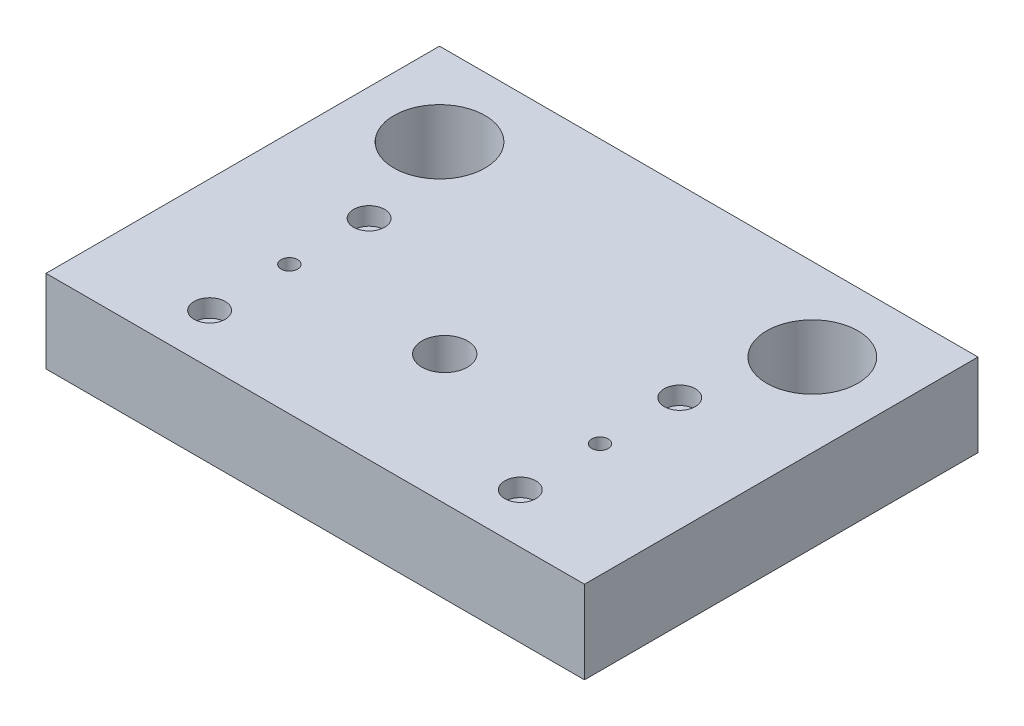
ISO-10303-21;
HEADER;
FILE_DESCRIPTION(('STEP AP214'),'2;1');
FILE_NAME('part.step','',(''),(''),'','','');
FILE_SCHEMA(('AUTOMOTIVE_DESIGN { 1 0 10303 214 1 1 1 1 }'));
ENDSEC;
DATA;
#1=APPLICATION_CONTEXT('core data for automotive mechanical design processes');
#2=APPLICATION_PROTOCOL_DEFINITION('international standard','automotive_design',2000,#1);
#3=PRODUCT_CONTEXT('',#1,'mechanical');
#4=PRODUCT('Part','Part','',(#3));
#5=PRODUCT_RELATED_PRODUCT_CATEGORY('part','',(#4));
#6=PRODUCT_DEFINITION_FORMATION('','',#4);
#7=PRODUCT_DEFINITION_CONTEXT('part definition',#1,'design');
#8=PRODUCT_DEFINITION('design','',#6,#7);
#9=PRODUCT_DEFINITION_SHAPE('','',#8);
#10=(LENGTH_UNIT() NAMED_UNIT(*) SI_UNIT(.MILLI.,.METRE.));
#11=(NAMED_UNIT(*) PLANE_ANGLE_UNIT() SI_UNIT($,.RADIAN.));
#12=(NAMED_UNIT(*) SI_UNIT($,.STERADIAN.) SOLID_ANGLE_UNIT());
#13=UNCERTAINTY_MEASURE_WITH_UNIT(LENGTH_MEASURE(1.E-05),#10,'distance_accuracy_value','');
#14=(GEOMETRIC_REPRESENTATION_CONTEXT(3) GLOBAL_UNCERTAINTY_ASSIGNED_CONTEXT((#13)) GLOBAL_UNIT_ASSIGNED_CONTEXT((#10,
#11,#12)) REPRESENTATION_CONTEXT('',''));
#15=CARTESIAN_POINT('',(0.,0.,0.));
#16=DIRECTION('',(0.,0.,1.));
#17=DIRECTION('',(1.,0.,0.));
#18=AXIS2_PLACEMENT_3D('',#15,#16,#17);
#19=CARTESIAN_POINT('',(0.,-40.,0.));
#20=DIRECTION('',(0.,-1.,0.));
#21=DIRECTION('',(0.,0.,-1.));
#22=AXIS2_PLACEMENT_3D('',#19,#20,#21);
#23=PLANE('',#22);
#24=CARTESIAN_POINT('',(-75.,-40.,32.5));
#25=DIRECTION('',(0.,1.,0.));
#26=DIRECTION('',(0.,0.,1.));
#27=AXIS2_PLACEMENT_3D('',#24,#25,#26);
#28=CIRCLE('',#27,3.99999999999999);
#29=CARTESIAN_POINT('',(-75.,-40.,36.5));
#30=VERTEX_POINT('',#29);
#31=EDGE_CURVE('E598',#30,#30,#28,.T.);
#32=ORIENTED_EDGE('',*,*,#31,.T.);
#33=EDGE_LOOP('',(#32));
#34=FACE_BOUND('',#33,.T.);
#35=DIRECTION('',(0.,0.,-1.));
#36=VECTOR('',#35,1.);
#37=CARTESIAN_POINT('',(130.,-40.,95.));
#38=LINE('',#37,#36);
#39=CARTESIAN_POINT('',(130.,-40.,95.));
#40=VERTEX_POINT('',#39);
#41=CARTESIAN_POINT('',(130.,-40.,-95.));
#42=VERTEX_POINT('',#41);
#43=EDGE_CURVE('E190',#40,#42,#38,.T.);
#44=ORIENTED_EDGE('',*,*,#43,.F.);
#45=DIRECTION('',(1.,0.,0.));
#46=VECTOR('',#45,1.);
#47=CARTESIAN_POINT('',(-130.,-40.,95.));
#48=LINE('',#47,#46);
#49=CARTESIAN_POINT('',(-130.,-40.,95.));
#50=VERTEX_POINT('',#49);
#51=EDGE_CURVE('E200',#50,#40,#48,.T.);
#52=ORIENTED_EDGE('',*,*,#51,.F.);
#53=DIRECTION('',(0.,0.,1.));
#54=VECTOR('',#53,1.);
#55=CARTESIAN_POINT('',(-130.,-40.,95.));
#56=LINE('',#55,#54);
#57=CARTESIAN_POINT('',(-130.,-40.,-95.));
#58=VERTEX_POINT('',#57);
#59=EDGE_CURVE('E197',#58,#50,#56,.T.);
#60=ORIENTED_EDGE('',*,*,#59,.F.);
#61=DIRECTION('',(-1.,0.,0.));
#62=VECTOR('',#61,1.);
#63=CARTESIAN_POINT('',(-130.,-40.,-95.));
#64=LINE('',#63,#62);
#65=EDGE_CURVE('E193',#42,#58,#64,.T.);
#66=ORIENTED_EDGE('',*,*,#65,.F.);
#67=EDGE_LOOP('',(#44,#52,#60,#66));
#68=FACE_BOUND('',#67,.T.);
#69=CARTESIAN_POINT('',(90.,-40.,-55.));
#70=DIRECTION('',(0.,1.,0.));
#71=DIRECTION('',(0.,0.,1.));
#72=AXIS2_PLACEMENT_3D('',#69,#70,#71);
#73=CIRCLE('',#72,22.);
#74=CARTESIAN_POINT('',(90.,-40.,-33.));
#75=VERTEX_POINT('',#74);
#76=EDGE_CURVE('E176',#75,#75,#73,.T.);
#77=ORIENTED_EDGE('',*,*,#76,.T.);
#78=EDGE_LOOP('',(#77));
#79=FACE_BOUND('',#78,.T.);
#80=CARTESIAN_POINT('',(-90.,-40.,-55.));
#81=DIRECTION('',(0.,1.,0.));
#82=DIRECTION('',(0.,0.,1.));
#83=AXIS2_PLACEMENT_3D('',#80,#81,#82);
#84=CIRCLE('',#83,22.);
#85=CARTESIAN_POINT('',(-90.,-40.,-33.));
#86=VERTEX_POINT('',#85);
#87=EDGE_CURVE('E178',#86,#86,#84,.T.);
#88=ORIENTED_EDGE('',*,*,#87,.T.);
#89=EDGE_LOOP('',(#88));
#90=FACE_BOUND('',#89,.T.);
#91=CARTESIAN_POINT('',(35.05,-40.,60.05));
#92=DIRECTION('',(0.,-1.,0.));
#93=DIRECTION('',(0.,0.,-1.));
#94=AXIS2_PLACEMENT_3D('',#91,#92,#93);
#95=CIRCLE('',#94,5.);
#96=CARTESIAN_POINT('',(35.05,-40.,55.05));
#97=VERTEX_POINT('',#96);
#98=CARTESIAN_POINT('',(30.05,-40.,60.05));
#99=VERTEX_POINT('',#98);
#100=EDGE_CURVE('E148',#97,#99,#95,.T.);
#101=ORIENTED_EDGE('',*,*,#100,.F.);
#102=DIRECTION('',(0.,0.,-1.));
#103=VECTOR('',#102,1.);
#104=CARTESIAN_POINT('',(35.05,-40.,60.05));
#105=LINE('',#104,#103);
#106=CARTESIAN_POINT('',(35.05,-40.,9.94999999999999));
#107=VERTEX_POINT('',#106);
#108=EDGE_CURVE('E169',#97,#107,#105,.T.);
#109=ORIENTED_EDGE('',*,*,#108,.T.);
#110=CARTESIAN_POINT('',(35.05,-40.,4.94999999999999));
#111=DIRECTION('',(0.,-1.,0.));
#112=DIRECTION('',(0.,0.,-1.));
#113=AXIS2_PLACEMENT_3D('',#110,#111,#112);
#114=CIRCLE('',#113,5.);
#115=CARTESIAN_POINT('',(30.05,-40.,4.94999999999999));
#116=VERTEX_POINT('',#115);
#117=EDGE_CURVE('E256',#116,#107,#114,.T.);
#118=ORIENTED_EDGE('',*,*,#117,.F.);
#119=DIRECTION('',(-1.,0.,0.));
#120=VECTOR('',#119,1.);
#121=CARTESIAN_POINT('',(35.05,-40.,4.94999999999999));
#122=LINE('',#121,#120);
#123=CARTESIAN_POINT('',(-30.05,-40.,4.94999999999999));
#124=VERTEX_POINT('',#123);
#125=EDGE_CURVE('E165',#116,#124,#122,.T.);
#126=ORIENTED_EDGE('',*,*,#125,.T.);
#127=CARTESIAN_POINT('',(-35.05,-40.,4.94999999999999));
#128=DIRECTION('',(0.,-1.,0.));
#129=DIRECTION('',(0.,0.,-1.));
#130=AXIS2_PLACEMENT_3D('',#127,#128,#129);
#131=CIRCLE('',#130,5.);
#132=CARTESIAN_POINT('',(-35.05,-40.,9.94999999999999));
#133=VERTEX_POINT('',#132);
#134=EDGE_CURVE('E163',#133,#124,#131,.T.);
#135=ORIENTED_EDGE('',*,*,#134,.F.);
#136=DIRECTION('',(0.,0.,1.));
#137=VECTOR('',#136,1.);
#138=CARTESIAN_POINT('',(-35.05,-40.,4.94999999999999));
#139=LINE('',#138,#137);
#140=CARTESIAN_POINT('',(-35.05,-40.,55.05));
#141=VERTEX_POINT('',#140);
#142=EDGE_CURVE('E154',#133,#141,#139,.T.);
#143=ORIENTED_EDGE('',*,*,#142,.T.);
#144=CARTESIAN_POINT('',(-35.05,-40.,60.05));
#145=DIRECTION('',(0.,-1.,0.));
#146=DIRECTION('',(0.,0.,-1.));
#147=AXIS2_PLACEMENT_3D('',#144,#145,#146);
#148=CIRCLE('',#147,5.);
#149=CARTESIAN_POINT('',(-30.05,-40.,60.05));
#150=VERTEX_POINT('',#149);
#151=EDGE_CURVE('E136',#150,#141,#148,.T.);
#152=ORIENTED_EDGE('',*,*,#151,.F.);
#153=DIRECTION('',(1.,0.,0.));
#154=VECTOR('',#153,1.);
#155=CARTESIAN_POINT('',(-35.05,-40.,60.05));
#156=LINE('',#155,#154);
#157=EDGE_CURVE('E164',#150,#99,#156,.T.);
#158=ORIENTED_EDGE('',*,*,#157,.T.);
#159=EDGE_LOOP('',(#101,#109,#118,#126,#135,#143,#152,#158));
#160=FACE_BOUND('',#159,.T.);
#161=CARTESIAN_POINT('',(75.,-40.,71.));
#162=DIRECTION('',(0.,1.,0.));
#163=DIRECTION('',(0.,0.,1.));
#164=AXIS2_PLACEMENT_3D('',#161,#162,#163);
#165=CIRCLE('',#164,4.19999999999998);
#166=CARTESIAN_POINT('',(75.,-40.,75.2));
#167=VERTEX_POINT('',#166);
#168=EDGE_CURVE('E257',#167,#167,#165,.T.);
#169=ORIENTED_EDGE('',*,*,#168,.T.);
#170=EDGE_LOOP('',(#169));
#171=FACE_BOUND('',#170,.T.);
#172=CARTESIAN_POINT('',(75.,-40.,-6.00000000000001));
#173=DIRECTION('',(0.,1.,0.));
#174=DIRECTION('',(0.,0.,1.));
#175=AXIS2_PLACEMENT_3D('',#172,#173,#174);
#176=CIRCLE('',#175,4.19999999999998);
#177=CARTESIAN_POINT('',(75.,-40.,-1.80000000000002));
#178=VERTEX_POINT('',#177);
#179=EDGE_CURVE('E644',#178,#178,#176,.T.);
#180=ORIENTED_EDGE('',*,*,#179,.T.);
#181=EDGE_LOOP('',(#180));
#182=FACE_BOUND('',#181,.T.);
#183=CARTESIAN_POINT('',(-75.,-40.,-6.00000000000001));
#184=DIRECTION('',(0.,1.,0.));
#185=DIRECTION('',(0.,0.,1.));
#186=AXIS2_PLACEMENT_3D('',#183,#184,#185);
#187=CIRCLE('',#186,4.19999999999998);
#188=CARTESIAN_POINT('',(-75.,-40.,-1.80000000000002));
#189=VERTEX_POINT('',#188);
#190=EDGE_CURVE('E632',#189,#189,#187,.T.);
#191=ORIENTED_EDGE('',*,*,#190,.T.);
#192=EDGE_LOOP('',(#191));
#193=FACE_BOUND('',#192,.T.);
#194=CARTESIAN_POINT('',(-75.,-40.,71.));
#195=DIRECTION('',(0.,1.,0.));
#196=DIRECTION('',(0.,0.,1.));
#197=AXIS2_PLACEMENT_3D('',#194,#195,#196);
#198=CIRCLE('',#197,4.19999999999998);
#199=CARTESIAN_POINT('',(-75.,-40.,75.2));
#200=VERTEX_POINT('',#199);
#201=EDGE_CURVE('E620',#200,#200,#198,.T.);
#202=ORIENTED_EDGE('',*,*,#201,.T.);
#203=EDGE_LOOP('',(#202));
#204=FACE_BOUND('',#203,.T.);
#205=CARTESIAN_POINT('',(75.,-40.,32.5));
#206=DIRECTION('',(0.,1.,0.));
#207=DIRECTION('',(0.,0.,1.));
#208=AXIS2_PLACEMENT_3D('',#205,#206,#207);
#209=CIRCLE('',#208,3.99999999999999);
#210=CARTESIAN_POINT('',(75.,-40.,36.5));
#211=VERTEX_POINT('',#210);
#212=EDGE_CURVE('E608',#211,#211,#209,.T.);
#213=ORIENTED_EDGE('',*,*,#212,.T.);
#214=EDGE_LOOP('',(#213));
#215=FACE_BOUND('',#214,.T.);
#216=ADVANCED_FACE('F49',(#34,#68,#79,#90,#160,#171,#182,#193,#204,#215),#23,.T.);
#217=CARTESIAN_POINT('',(0.,0.,0.));
#218=DIRECTION('',(0.,-1.,0.));
#219=DIRECTION('',(0.,0.,-1.));
#220=AXIS2_PLACEMENT_3D('',#217,#218,#219);
#221=PLANE('',#220);
#222=CARTESIAN_POINT('',(-75.,0.,32.5));
#223=DIRECTION('',(0.,1.,0.));
#224=DIRECTION('',(0.,0.,1.));
#225=AXIS2_PLACEMENT_3D('',#222,#223,#224);
#226=CIRCLE('',#225,4.);
#227=CARTESIAN_POINT('',(-75.,0.,36.5));
#228=VERTEX_POINT('',#227);
#229=EDGE_CURVE('E601',#228,#228,#226,.T.);
#230=ORIENTED_EDGE('',*,*,#229,.F.);
#231=EDGE_LOOP('',(#230));
#232=FACE_BOUND('',#231,.T.);
#233=CARTESIAN_POINT('',(75.,0.,32.5));
#234=DIRECTION('',(0.,1.,0.));
#235=DIRECTION('',(0.,0.,1.));
#236=AXIS2_PLACEMENT_3D('',#233,#234,#235);
#237=CIRCLE('',#236,4.);
#238=CARTESIAN_POINT('',(75.,0.,36.5));
#239=VERTEX_POINT('',#238);
#240=EDGE_CURVE('E603',#239,#239,#237,.T.);
#241=ORIENTED_EDGE('',*,*,#240,.F.);
#242=EDGE_LOOP('',(#241));
#243=FACE_BOUND('',#242,.T.);
#244=CARTESIAN_POINT('',(-75.,0.,71.));
#245=DIRECTION('',(0.,1.,0.));
#246=DIRECTION('',(0.,0.,1.));
#247=AXIS2_PLACEMENT_3D('',#244,#245,#246);
#248=CIRCLE('',#247,7.50000000000001);
#249=CARTESIAN_POINT('',(-75.,0.,78.5));
#250=VERTEX_POINT('',#249);
#251=EDGE_CURVE('E611',#250,#250,#248,.T.);
#252=ORIENTED_EDGE('',*,*,#251,.F.);
#253=EDGE_LOOP('',(#252));
#254=FACE_BOUND('',#253,.T.);
#255=CARTESIAN_POINT('',(-75.,0.,-6.00000000000001));
#256=DIRECTION('',(0.,1.,0.));
#257=DIRECTION('',(0.,0.,1.));
#258=AXIS2_PLACEMENT_3D('',#255,#256,#257);
#259=CIRCLE('',#258,7.50000000000001);
#260=CARTESIAN_POINT('',(-75.,0.,1.5));
#261=VERTEX_POINT('',#260);
#262=EDGE_CURVE('E623',#261,#261,#259,.T.);
#263=ORIENTED_EDGE('',*,*,#262,.F.);
#264=EDGE_LOOP('',(#263));
#265=FACE_BOUND('',#264,.T.);
#266=CARTESIAN_POINT('',(75.,0.,-6.00000000000001));
#267=DIRECTION('',(0.,1.,0.));
#268=DIRECTION('',(0.,0.,1.));
#269=AXIS2_PLACEMENT_3D('',#266,#267,#268);
#270=CIRCLE('',#269,7.50000000000001);
#271=CARTESIAN_POINT('',(75.,0.,1.5));
#272=VERTEX_POINT('',#271);
#273=EDGE_CURVE('E635',#272,#272,#270,.T.);
#274=ORIENTED_EDGE('',*,*,#273,.F.);
#275=EDGE_LOOP('',(#274));
#276=FACE_BOUND('',#275,.T.);
#277=CARTESIAN_POINT('',(75.,0.,71.));
#278=DIRECTION('',(0.,1.,0.));
#279=DIRECTION('',(0.,0.,1.));
#280=AXIS2_PLACEMENT_3D('',#277,#278,#279);
#281=CIRCLE('',#280,7.50000000000001);
#282=CARTESIAN_POINT('',(75.,0.,78.5));
#283=VERTEX_POINT('',#282);
#284=EDGE_CURVE('E647',#283,#283,#281,.T.);
#285=ORIENTED_EDGE('',*,*,#284,.F.);
#286=EDGE_LOOP('',(#285));
#287=FACE_BOUND('',#286,.T.);
#288=CARTESIAN_POINT('',(-90.,0.,-55.));
#289=DIRECTION('',(0.,1.,0.));
#290=DIRECTION('',(0.,0.,1.));
#291=AXIS2_PLACEMENT_3D('',#288,#289,#290);
#292=CIRCLE('',#291,22.);
#293=CARTESIAN_POINT('',(-90.,0.,-33.));
#294=VERTEX_POINT('',#293);
#295=EDGE_CURVE('E182',#294,#294,#292,.T.);
#296=ORIENTED_EDGE('',*,*,#295,.F.);
#297=EDGE_LOOP('',(#296));
#298=FACE_BOUND('',#297,.T.);
#299=CARTESIAN_POINT('',(90.,0.,-55.));
#300=DIRECTION('',(0.,1.,0.));
#301=DIRECTION('',(0.,0.,1.));
#302=AXIS2_PLACEMENT_3D('',#299,#300,#301);
#303=CIRCLE('',#302,22.);
#304=CARTESIAN_POINT('',(90.,0.,-33.));
#305=VERTEX_POINT('',#304);
#306=EDGE_CURVE('E185',#305,#305,#303,.T.);
#307=ORIENTED_EDGE('',*,*,#306,.F.);
#308=EDGE_LOOP('',(#307));
#309=FACE_BOUND('',#308,.T.);
#310=DIRECTION('',(0.,0.,-1.));
#311=VECTOR('',#310,1.);
#312=CARTESIAN_POINT('',(130.,0.,95.));
#313=LINE('',#312,#311);
#314=CARTESIAN_POINT('',(130.,0.,95.));
#315=VERTEX_POINT('',#314);
#316=CARTESIAN_POINT('',(130.,0.,-95.));
#317=VERTEX_POINT('',#316);
#318=EDGE_CURVE('E181',#315,#317,#313,.T.);
#319=ORIENTED_EDGE('',*,*,#318,.T.);
#320=DIRECTION('',(-1.,0.,0.));
#321=VECTOR('',#320,1.);
#322=CARTESIAN_POINT('',(-130.,0.,-95.));
#323=LINE('',#322,#321);
#324=CARTESIAN_POINT('',(-130.,0.,-95.));
#325=VERTEX_POINT('',#324);
#326=EDGE_CURVE('E206',#317,#325,#323,.T.);
#327=ORIENTED_EDGE('',*,*,#326,.T.);
#328=DIRECTION('',(0.,0.,1.));
#329=VECTOR('',#328,1.);
#330=CARTESIAN_POINT('',(-130.,0.,95.));
#331=LINE('',#330,#329);
#332=CARTESIAN_POINT('',(-130.,0.,95.));
#333=VERTEX_POINT('',#332);
#334=EDGE_CURVE('E209',#325,#333,#331,.T.);
#335=ORIENTED_EDGE('',*,*,#334,.T.);
#336=DIRECTION('',(1.,0.,0.));
#337=VECTOR('',#336,1.);
#338=CARTESIAN_POINT('',(-130.,0.,95.));
#339=LINE('',#338,#337);
#340=EDGE_CURVE('E194',#333,#315,#339,.T.);
#341=ORIENTED_EDGE('',*,*,#340,.T.);
#342=EDGE_LOOP('',(#319,#327,#335,#341));
#343=FACE_BOUND('',#342,.T.);
#344=CARTESIAN_POINT('',(0.,0.,32.5));
#345=DIRECTION('',(0.,1.,0.));
#346=DIRECTION('',(0.,0.,1.));
#347=AXIS2_PLACEMENT_3D('',#344,#345,#346);
#348=CIRCLE('',#347,11.);
#349=CARTESIAN_POINT('',(0.,0.,43.5));
#350=VERTEX_POINT('',#349);
#351=EDGE_CURVE('E173',#350,#350,#348,.T.);
#352=ORIENTED_EDGE('',*,*,#351,.F.);
#353=EDGE_LOOP('',(#352));
#354=FACE_BOUND('',#353,.T.);
#355=ADVANCED_FACE('F285',(#232,#243,#254,#265,#276,#287,#298,#309,#343,#354),#221,.F.);
#356=CARTESIAN_POINT('',(130.,-40.,95.));
#357=DIRECTION('',(1.,0.,0.));
#358=DIRECTION('',(0.,0.,-1.));
#359=AXIS2_PLACEMENT_3D('',#356,#357,#358);
#360=PLANE('',#359);
#361=ORIENTED_EDGE('',*,*,#318,.F.);
#362=DIRECTION('',(0.,1.,0.));
#363=VECTOR('',#362,1.);
#364=CARTESIAN_POINT('',(130.,-40.,95.));
#365=LINE('',#364,#363);
#366=EDGE_CURVE('E214',#40,#315,#365,.T.);
#367=ORIENTED_EDGE('',*,*,#366,.F.);
#368=ORIENTED_EDGE('',*,*,#43,.T.);
#369=DIRECTION('',(0.,1.,0.));
#370=VECTOR('',#369,1.);
#371=CARTESIAN_POINT('',(130.,-40.,-95.));
#372=LINE('',#371,#370);
#373=EDGE_CURVE('E203',#42,#317,#372,.T.);
#374=ORIENTED_EDGE('',*,*,#373,.T.);
#375=EDGE_LOOP('',(#361,#367,#368,#374));
#376=FACE_BOUND('',#375,.T.);
#377=ADVANCED_FACE('F51',(#376),#360,.T.);
#378=CARTESIAN_POINT('',(-130.,-40.,95.));
#379=DIRECTION('',(0.,0.,1.));
#380=DIRECTION('',(1.,0.,0.));
#381=AXIS2_PLACEMENT_3D('',#378,#379,#380);
#382=PLANE('',#381);
#383=ORIENTED_EDGE('',*,*,#340,.F.);
#384=DIRECTION('',(0.,1.,0.));
#385=VECTOR('',#384,1.);
#386=CARTESIAN_POINT('',(-130.,-40.,95.));
#387=LINE('',#386,#385);
#388=EDGE_CURVE('E216',#50,#333,#387,.T.);
#389=ORIENTED_EDGE('',*,*,#388,.F.);
#390=ORIENTED_EDGE('',*,*,#51,.T.);
#391=ORIENTED_EDGE('',*,*,#366,.T.);
#392=EDGE_LOOP('',(#383,#389,#390,#391));
#393=FACE_BOUND('',#392,.T.);
#394=ADVANCED_FACE('F300',(#393),#382,.T.);
#395=CARTESIAN_POINT('',(-130.,-40.,95.));
#396=DIRECTION('',(-1.,0.,0.));
#397=DIRECTION('',(0.,0.,1.));
#398=AXIS2_PLACEMENT_3D('',#395,#396,#397);
#399=PLANE('',#398);
#400=ORIENTED_EDGE('',*,*,#334,.F.);
#401=DIRECTION('',(0.,1.,0.));
#402=VECTOR('',#401,1.);
#403=CARTESIAN_POINT('',(-130.,-40.,-95.));
#404=LINE('',#403,#402);
#405=EDGE_CURVE('E218',#58,#325,#404,.T.);
#406=ORIENTED_EDGE('',*,*,#405,.F.);
#407=ORIENTED_EDGE('',*,*,#59,.T.);
#408=ORIENTED_EDGE('',*,*,#388,.T.);
#409=EDGE_LOOP('',(#400,#406,#407,#408));
#410=FACE_BOUND('',#409,.T.);
#411=ADVANCED_FACE('F303',(#410),#399,.T.);
#412=CARTESIAN_POINT('',(-130.,-40.,-95.));
#413=DIRECTION('',(0.,0.,-1.));
#414=DIRECTION('',(-1.,0.,0.));
#415=AXIS2_PLACEMENT_3D('',#412,#413,#414);
#416=PLANE('',#415);
#417=ORIENTED_EDGE('',*,*,#326,.F.);
#418=ORIENTED_EDGE('',*,*,#373,.F.);
#419=ORIENTED_EDGE('',*,*,#65,.T.);
#420=ORIENTED_EDGE('',*,*,#405,.T.);
#421=EDGE_LOOP('',(#417,#418,#419,#420));
#422=FACE_BOUND('',#421,.T.);
#423=ADVANCED_FACE('F306',(#422),#416,.T.);
#424=CARTESIAN_POINT('',(90.,-40.,-55.));
#425=DIRECTION('',(0.,1.,0.));
#426=DIRECTION('',(0.,0.,1.));
#427=AXIS2_PLACEMENT_3D('',#424,#425,#426);
#428=CYLINDRICAL_SURFACE('',#427,22.);
#429=ORIENTED_EDGE('',*,*,#76,.F.);
#430=EDGE_LOOP('',(#429));
#431=FACE_BOUND('',#430,.T.);
#432=ORIENTED_EDGE('',*,*,#306,.T.);
#433=EDGE_LOOP('',(#432));
#434=FACE_BOUND('',#433,.T.);
#435=ADVANCED_FACE('F297',(#431,#434),#428,.F.);
#436=CARTESIAN_POINT('',(-90.,-40.,-55.));
#437=DIRECTION('',(0.,1.,0.));
#438=DIRECTION('',(0.,0.,1.));
#439=AXIS2_PLACEMENT_3D('',#436,#437,#438);
#440=CYLINDRICAL_SURFACE('',#439,22.);
#441=ORIENTED_EDGE('',*,*,#87,.F.);
#442=EDGE_LOOP('',(#441));
#443=FACE_BOUND('',#442,.T.);
#444=ORIENTED_EDGE('',*,*,#295,.T.);
#445=EDGE_LOOP('',(#444));
#446=FACE_BOUND('',#445,.T.);
#447=ADVANCED_FACE('F313',(#443,#446),#440,.F.);
#448=CARTESIAN_POINT('',(0.,0.,32.5));
#449=DIRECTION('',(0.,1.,0.));
#450=DIRECTION('',(0.,0.,1.));
#451=AXIS2_PLACEMENT_3D('',#448,#449,#450);
#452=CYLINDRICAL_SURFACE('',#451,11.);
#453=CARTESIAN_POINT('',(0.,-20.,32.5));
#454=DIRECTION('',(0.,1.,0.));
#455=DIRECTION('',(0.,0.,1.));
#456=AXIS2_PLACEMENT_3D('',#453,#454,#455);
#457=CIRCLE('',#456,11.);
#458=CARTESIAN_POINT('',(0.,-20.,43.5));
#459=VERTEX_POINT('',#458);
#460=EDGE_CURVE('E177',#459,#459,#457,.F.);
#461=ORIENTED_EDGE('',*,*,#460,.T.);
#462=EDGE_LOOP('',(#461));
#463=FACE_BOUND('',#462,.T.);
#464=ORIENTED_EDGE('',*,*,#351,.T.);
#465=EDGE_LOOP('',(#464));
#466=FACE_BOUND('',#465,.T.);
#467=ADVANCED_FACE('F333',(#463,#466),#452,.F.);
#468=CARTESIAN_POINT('',(0.,-20.,0.));
#469=DIRECTION('',(0.,1.,0.));
#470=DIRECTION('',(0.,0.,1.));
#471=AXIS2_PLACEMENT_3D('',#468,#469,#470);
#472=PLANE('',#471);
#473=DIRECTION('',(0.,0.,-1.));
#474=VECTOR('',#473,1.);
#475=CARTESIAN_POINT('',(35.05,-20.,60.05));
#476=LINE('',#475,#474);
#477=CARTESIAN_POINT('',(35.05,-20.,55.05));
#478=VERTEX_POINT('',#477);
#479=CARTESIAN_POINT('',(35.05,-20.,9.94999999999999));
#480=VERTEX_POINT('',#479);
#481=EDGE_CURVE('E167',#478,#480,#476,.T.);
#482=ORIENTED_EDGE('',*,*,#481,.F.);
#483=CARTESIAN_POINT('',(35.05,-20.,60.05));
#484=DIRECTION('',(0.,1.,0.));
#485=DIRECTION('',(0.,0.,1.));
#486=AXIS2_PLACEMENT_3D('',#483,#484,#485);
#487=CIRCLE('',#486,5.);
#488=CARTESIAN_POINT('',(30.05,-20.,60.05));
#489=VERTEX_POINT('',#488);
#490=EDGE_CURVE('E255',#478,#489,#487,.F.);
#491=ORIENTED_EDGE('',*,*,#490,.T.);
#492=DIRECTION('',(1.,0.,0.));
#493=VECTOR('',#492,1.);
#494=CARTESIAN_POINT('',(-35.05,-20.,60.05));
#495=LINE('',#494,#493);
#496=CARTESIAN_POINT('',(-30.05,-20.,60.05));
#497=VERTEX_POINT('',#496);
#498=EDGE_CURVE('E223',#497,#489,#495,.T.);
#499=ORIENTED_EDGE('',*,*,#498,.F.);
#500=CARTESIAN_POINT('',(-35.05,-20.,60.05));
#501=DIRECTION('',(0.,1.,0.));
#502=DIRECTION('',(0.,0.,1.));
#503=AXIS2_PLACEMENT_3D('',#500,#501,#502);
#504=CIRCLE('',#503,5.);
#505=CARTESIAN_POINT('',(-35.05,-20.,55.05));
#506=VERTEX_POINT('',#505);
#507=EDGE_CURVE('E147',#497,#506,#504,.F.);
#508=ORIENTED_EDGE('',*,*,#507,.T.);
#509=DIRECTION('',(0.,0.,1.));
#510=VECTOR('',#509,1.);
#511=CARTESIAN_POINT('',(-35.05,-20.,4.94999999999999));
#512=LINE('',#511,#510);
#513=CARTESIAN_POINT('',(-35.05,-20.,9.94999999999999));
#514=VERTEX_POINT('',#513);
#515=EDGE_CURVE('E156',#514,#506,#512,.T.);
#516=ORIENTED_EDGE('',*,*,#515,.F.);
#517=CARTESIAN_POINT('',(-35.05,-20.,4.94999999999999));
#518=DIRECTION('',(0.,1.,0.));
#519=DIRECTION('',(0.,0.,1.));
#520=AXIS2_PLACEMENT_3D('',#517,#518,#519);
#521=CIRCLE('',#520,5.);
#522=CARTESIAN_POINT('',(-30.05,-20.,4.94999999999999));
#523=VERTEX_POINT('',#522);
#524=EDGE_CURVE('E71',#514,#523,#521,.F.);
#525=ORIENTED_EDGE('',*,*,#524,.T.);
#526=DIRECTION('',(-1.,0.,0.));
#527=VECTOR('',#526,1.);
#528=CARTESIAN_POINT('',(35.05,-20.,4.94999999999999));
#529=LINE('',#528,#527);
#530=CARTESIAN_POINT('',(30.05,-20.,4.94999999999999));
#531=VERTEX_POINT('',#530);
#532=EDGE_CURVE('E235',#531,#523,#529,.T.);
#533=ORIENTED_EDGE('',*,*,#532,.F.);
#534=CARTESIAN_POINT('',(35.05,-20.,4.94999999999999));
#535=DIRECTION('',(0.,1.,0.));
#536=DIRECTION('',(0.,0.,1.));
#537=AXIS2_PLACEMENT_3D('',#534,#535,#536);
#538=CIRCLE('',#537,5.);
#539=EDGE_CURVE('E63',#531,#480,#538,.F.);
#540=ORIENTED_EDGE('',*,*,#539,.T.);
#541=EDGE_LOOP('',(#482,#491,#499,#508,#516,#525,#533,#540));
#542=FACE_BOUND('',#541,.T.);
#543=ORIENTED_EDGE('',*,*,#460,.F.);
#544=EDGE_LOOP('',(#543));
#545=FACE_BOUND('',#544,.T.);
#546=ADVANCED_FACE('F230',(#542,#545),#472,.F.);
#547=CARTESIAN_POINT('',(35.05,-20.,60.05));
#548=DIRECTION('',(-1.,0.,0.));
#549=DIRECTION('',(0.,0.,1.));
#550=AXIS2_PLACEMENT_3D('',#547,#548,#549);
#551=PLANE('',#550);
#552=DIRECTION('',(0.,-1.,0.));
#553=VECTOR('',#552,1.);
#554=CARTESIAN_POINT('',(35.05,-5.85786437626904,55.05));
#555=LINE('',#554,#553);
#556=EDGE_CURVE('E157',#478,#97,#555,.T.);
#557=ORIENTED_EDGE('',*,*,#556,.F.);
#558=ORIENTED_EDGE('',*,*,#481,.T.);
#559=DIRECTION('',(0.,-1.,0.));
#560=VECTOR('',#559,1.);
#561=CARTESIAN_POINT('',(35.05,-5.85786437626904,9.94999999999999));
#562=LINE('',#561,#560);
#563=EDGE_CURVE('E242',#107,#480,#562,.F.);
#564=ORIENTED_EDGE('',*,*,#563,.F.);
#565=ORIENTED_EDGE('',*,*,#108,.F.);
#566=EDGE_LOOP('',(#557,#558,#564,#565));
#567=FACE_BOUND('',#566,.T.);
#568=ADVANCED_FACE('F253',(#567),#551,.T.);
#569=CARTESIAN_POINT('',(35.05,-20.,4.94999999999999));
#570=DIRECTION('',(0.,0.,1.));
#571=DIRECTION('',(1.,0.,0.));
#572=AXIS2_PLACEMENT_3D('',#569,#570,#571);
#573=PLANE('',#572);
#574=DIRECTION('',(0.,-1.,0.));
#575=VECTOR('',#574,1.);
#576=CARTESIAN_POINT('',(-30.05,-5.85786437626904,4.94999999999999));
#577=LINE('',#576,#575);
#578=EDGE_CURVE('E245',#124,#523,#577,.F.);
#579=ORIENTED_EDGE('',*,*,#578,.F.);
#580=ORIENTED_EDGE('',*,*,#125,.F.);
#581=DIRECTION('',(0.,-1.,0.));
#582=VECTOR('',#581,1.);
#583=CARTESIAN_POINT('',(30.05,-5.85786437626904,4.94999999999999));
#584=LINE('',#583,#582);
#585=EDGE_CURVE('E11',#531,#116,#584,.T.);
#586=ORIENTED_EDGE('',*,*,#585,.F.);
#587=ORIENTED_EDGE('',*,*,#532,.T.);
#588=EDGE_LOOP('',(#579,#580,#586,#587));
#589=FACE_BOUND('',#588,.T.);
#590=ADVANCED_FACE('F281',(#589),#573,.T.);
#591=CARTESIAN_POINT('',(-35.05,-20.,4.94999999999999));
#592=DIRECTION('',(1.,0.,0.));
#593=DIRECTION('',(0.,0.,-1.));
#594=AXIS2_PLACEMENT_3D('',#591,#592,#593);
#595=PLANE('',#594);
#596=DIRECTION('',(0.,-1.,0.));
#597=VECTOR('',#596,1.);
#598=CARTESIAN_POINT('',(-35.05,-5.85786437626904,9.94999999999999));
#599=LINE('',#598,#597);
#600=EDGE_CURVE('E57',#514,#133,#599,.T.);
#601=ORIENTED_EDGE('',*,*,#600,.F.);
#602=ORIENTED_EDGE('',*,*,#515,.T.);
#603=DIRECTION('',(0.,-1.,0.));
#604=VECTOR('',#603,1.);
#605=CARTESIAN_POINT('',(-35.05,-5.85786437626904,55.05));
#606=LINE('',#605,#604);
#607=EDGE_CURVE('E139',#141,#506,#606,.F.);
#608=ORIENTED_EDGE('',*,*,#607,.F.);
#609=ORIENTED_EDGE('',*,*,#142,.F.);
#610=EDGE_LOOP('',(#601,#602,#608,#609));
#611=FACE_BOUND('',#610,.T.);
#612=ADVANCED_FACE('F153',(#611),#595,.T.);
#613=CARTESIAN_POINT('',(-35.05,-20.,60.05));
#614=DIRECTION('',(0.,0.,-1.));
#615=DIRECTION('',(-1.,0.,0.));
#616=AXIS2_PLACEMENT_3D('',#613,#614,#615);
#617=PLANE('',#616);
#618=DIRECTION('',(0.,-1.,0.));
#619=VECTOR('',#618,1.);
#620=CARTESIAN_POINT('',(30.05,-5.85786437626904,60.05));
#621=LINE('',#620,#619);
#622=EDGE_CURVE('E225',#99,#489,#621,.F.);
#623=ORIENTED_EDGE('',*,*,#622,.F.);
#624=ORIENTED_EDGE('',*,*,#157,.F.);
#625=DIRECTION('',(0.,-1.,0.));
#626=VECTOR('',#625,1.);
#627=CARTESIAN_POINT('',(-30.05,-5.85786437626904,60.05));
#628=LINE('',#627,#626);
#629=EDGE_CURVE('E142',#497,#150,#628,.T.);
#630=ORIENTED_EDGE('',*,*,#629,.F.);
#631=ORIENTED_EDGE('',*,*,#498,.T.);
#632=EDGE_LOOP('',(#623,#624,#630,#631));
#633=FACE_BOUND('',#632,.T.);
#634=ADVANCED_FACE('F273',(#633),#617,.T.);
#635=CARTESIAN_POINT('',(-35.05,-5.85786437626904,60.05));
#636=DIRECTION('',(0.,-1.,0.));
#637=DIRECTION('',(0.,0.,-1.));
#638=AXIS2_PLACEMENT_3D('',#635,#636,#637);
#639=CYLINDRICAL_SURFACE('',#638,5.);
#640=ORIENTED_EDGE('',*,*,#607,.T.);
#641=ORIENTED_EDGE('',*,*,#507,.F.);
#642=ORIENTED_EDGE('',*,*,#629,.T.);
#643=ORIENTED_EDGE('',*,*,#151,.T.);
#644=EDGE_LOOP('',(#640,#641,#642,#643));
#645=FACE_BOUND('',#644,.T.);
#646=ADVANCED_FACE('F138',(#645),#639,.F.);
#647=CARTESIAN_POINT('',(35.05,-5.85786437626904,60.05));
#648=DIRECTION('',(0.,-1.,0.));
#649=DIRECTION('',(0.,0.,-1.));
#650=AXIS2_PLACEMENT_3D('',#647,#648,#649);
#651=CYLINDRICAL_SURFACE('',#650,5.);
#652=ORIENTED_EDGE('',*,*,#556,.T.);
#653=ORIENTED_EDGE('',*,*,#100,.T.);
#654=ORIENTED_EDGE('',*,*,#622,.T.);
#655=ORIENTED_EDGE('',*,*,#490,.F.);
#656=EDGE_LOOP('',(#652,#653,#654,#655));
#657=FACE_BOUND('',#656,.T.);
#658=ADVANCED_FACE('F270',(#657),#651,.F.);
#659=CARTESIAN_POINT('',(-35.05,-5.85786437626904,4.94999999999999));
#660=DIRECTION('',(0.,-1.,0.));
#661=DIRECTION('',(0.,0.,-1.));
#662=AXIS2_PLACEMENT_3D('',#659,#660,#661);
#663=CYLINDRICAL_SURFACE('',#662,5.);
#664=ORIENTED_EDGE('',*,*,#578,.T.);
#665=ORIENTED_EDGE('',*,*,#524,.F.);
#666=ORIENTED_EDGE('',*,*,#600,.T.);
#667=ORIENTED_EDGE('',*,*,#134,.T.);
#668=EDGE_LOOP('',(#664,#665,#666,#667));
#669=FACE_BOUND('',#668,.T.);
#670=ADVANCED_FACE('F226',(#669),#663,.F.);
#671=CARTESIAN_POINT('',(35.05,-5.85786437626904,4.94999999999999));
#672=DIRECTION('',(0.,-1.,0.));
#673=DIRECTION('',(0.,0.,-1.));
#674=AXIS2_PLACEMENT_3D('',#671,#672,#673);
#675=CYLINDRICAL_SURFACE('',#674,5.);
#676=ORIENTED_EDGE('',*,*,#563,.T.);
#677=ORIENTED_EDGE('',*,*,#539,.F.);
#678=ORIENTED_EDGE('',*,*,#585,.T.);
#679=ORIENTED_EDGE('',*,*,#117,.T.);
#680=EDGE_LOOP('',(#676,#677,#678,#679));
#681=FACE_BOUND('',#680,.T.);
#682=ADVANCED_FACE('F353',(#681),#675,.F.);
#683=CARTESIAN_POINT('',(75.,0.,71.));
#684=DIRECTION('',(0.,1.,0.));
#685=DIRECTION('',(0.,0.,1.));
#686=AXIS2_PLACEMENT_3D('',#683,#684,#685);
#687=CYLINDRICAL_SURFACE('',#686,4.19999999999999);
#688=ORIENTED_EDGE('',*,*,#168,.F.);
#689=EDGE_LOOP('',(#688));
#690=FACE_BOUND('',#689,.T.);
#691=CARTESIAN_POINT('',(75.,-8.6,71.));
#692=DIRECTION('',(0.,1.,0.));
#693=DIRECTION('',(0.,0.,1.));
#694=AXIS2_PLACEMENT_3D('',#691,#692,#693);
#695=CIRCLE('',#694,4.2);
#696=CARTESIAN_POINT('',(75.,-8.6,75.2));
#697=VERTEX_POINT('',#696);
#698=EDGE_CURVE('E261',#697,#697,#695,.T.);
#699=ORIENTED_EDGE('',*,*,#698,.T.);
#700=EDGE_LOOP('',(#699));
#701=FACE_BOUND('',#700,.T.);
#702=ADVANCED_FACE('F355',(#690,#701),#687,.F.);
#703=CARTESIAN_POINT('',(79.2,-8.6,71.));
#704=DIRECTION('',(0.,-1.,0.));
#705=DIRECTION('',(0.,0.,-1.));
#706=AXIS2_PLACEMENT_3D('',#703,#704,#705);
#707=PLANE('',#706);
#708=ORIENTED_EDGE('',*,*,#698,.F.);
#709=EDGE_LOOP('',(#708));
#710=FACE_BOUND('',#709,.T.);
#711=CARTESIAN_POINT('',(75.,-8.6,71.));
#712=DIRECTION('',(0.,1.,0.));
#713=DIRECTION('',(0.,0.,1.));
#714=AXIS2_PLACEMENT_3D('',#711,#712,#713);
#715=CIRCLE('',#714,7.49999999999999);
#716=CARTESIAN_POINT('',(75.,-8.6,78.5));
#717=VERTEX_POINT('',#716);
#718=EDGE_CURVE('E650',#717,#717,#715,.T.);
#719=ORIENTED_EDGE('',*,*,#718,.T.);
#720=EDGE_LOOP('',(#719));
#721=FACE_BOUND('',#720,.T.);
#722=ADVANCED_FACE('F361',(#710,#721),#707,.F.);
#723=CARTESIAN_POINT('',(75.,0.,71.));
#724=DIRECTION('',(0.,1.,0.));
#725=DIRECTION('',(0.,0.,1.));
#726=AXIS2_PLACEMENT_3D('',#723,#724,#725);
#727=CYLINDRICAL_SURFACE('',#726,7.5);
#728=ORIENTED_EDGE('',*,*,#718,.F.);
#729=EDGE_LOOP('',(#728));
#730=FACE_BOUND('',#729,.T.);
#731=ORIENTED_EDGE('',*,*,#284,.T.);
#732=EDGE_LOOP('',(#731));
#733=FACE_BOUND('',#732,.T.);
#734=ADVANCED_FACE('F430',(#730,#733),#727,.F.);
#735=CARTESIAN_POINT('',(75.,0.,-6.00000000000001));
#736=DIRECTION('',(0.,1.,0.));
#737=DIRECTION('',(0.,0.,1.));
#738=AXIS2_PLACEMENT_3D('',#735,#736,#737);
#739=CYLINDRICAL_SURFACE('',#738,4.19999999999999);
#740=ORIENTED_EDGE('',*,*,#179,.F.);
#741=EDGE_LOOP('',(#740));
#742=FACE_BOUND('',#741,.T.);
#743=CARTESIAN_POINT('',(75.,-8.6,-6.00000000000001));
#744=DIRECTION('',(0.,1.,0.));
#745=DIRECTION('',(0.,0.,1.));
#746=AXIS2_PLACEMENT_3D('',#743,#744,#745);
#747=CIRCLE('',#746,4.2);
#748=CARTESIAN_POINT('',(75.,-8.6,-1.80000000000001));
#749=VERTEX_POINT('',#748);
#750=EDGE_CURVE('E641',#749,#749,#747,.T.);
#751=ORIENTED_EDGE('',*,*,#750,.T.);
#752=EDGE_LOOP('',(#751));
#753=FACE_BOUND('',#752,.T.);
#754=ADVANCED_FACE('F438',(#742,#753),#739,.F.);
#755=CARTESIAN_POINT('',(79.2,-8.6,-6.00000000000001));
#756=DIRECTION('',(0.,-1.,0.));
#757=DIRECTION('',(0.,0.,-1.));
#758=AXIS2_PLACEMENT_3D('',#755,#756,#757);
#759=PLANE('',#758);
#760=ORIENTED_EDGE('',*,*,#750,.F.);
#761=EDGE_LOOP('',(#760));
#762=FACE_BOUND('',#761,.T.);
#763=CARTESIAN_POINT('',(75.,-8.6,-6.00000000000001));
#764=DIRECTION('',(0.,1.,0.));
#765=DIRECTION('',(0.,0.,1.));
#766=AXIS2_PLACEMENT_3D('',#763,#764,#765);
#767=CIRCLE('',#766,7.49999999999999);
#768=CARTESIAN_POINT('',(75.,-8.6,1.49999999999999));
#769=VERTEX_POINT('',#768);
#770=EDGE_CURVE('E638',#769,#769,#767,.T.);
#771=ORIENTED_EDGE('',*,*,#770,.T.);
#772=EDGE_LOOP('',(#771));
#773=FACE_BOUND('',#772,.T.);
#774=ADVANCED_FACE('F447',(#762,#773),#759,.F.);
#775=CARTESIAN_POINT('',(75.,0.,-6.00000000000001));
#776=DIRECTION('',(0.,1.,0.));
#777=DIRECTION('',(0.,0.,1.));
#778=AXIS2_PLACEMENT_3D('',#775,#776,#777);
#779=CYLINDRICAL_SURFACE('',#778,7.5);
#780=ORIENTED_EDGE('',*,*,#770,.F.);
#781=EDGE_LOOP('',(#780));
#782=FACE_BOUND('',#781,.T.);
#783=ORIENTED_EDGE('',*,*,#273,.T.);
#784=EDGE_LOOP('',(#783));
#785=FACE_BOUND('',#784,.T.);
#786=ADVANCED_FACE('F456',(#782,#785),#779,.F.);
#787=CARTESIAN_POINT('',(-75.,0.,-6.00000000000001));
#788=DIRECTION('',(0.,1.,0.));
#789=DIRECTION('',(0.,0.,1.));
#790=AXIS2_PLACEMENT_3D('',#787,#788,#789);
#791=CYLINDRICAL_SURFACE('',#790,4.19999999999999);
#792=ORIENTED_EDGE('',*,*,#190,.F.);
#793=EDGE_LOOP('',(#792));
#794=FACE_BOUND('',#793,.T.);
#795=CARTESIAN_POINT('',(-75.,-8.6,-6.00000000000001));
#796=DIRECTION('',(0.,1.,0.));
#797=DIRECTION('',(0.,0.,1.));
#798=AXIS2_PLACEMENT_3D('',#795,#796,#797);
#799=CIRCLE('',#798,4.2);
#800=CARTESIAN_POINT('',(-75.,-8.6,-1.80000000000001));
#801=VERTEX_POINT('',#800);
#802=EDGE_CURVE('E629',#801,#801,#799,.T.);
#803=ORIENTED_EDGE('',*,*,#802,.T.);
#804=EDGE_LOOP('',(#803));
#805=FACE_BOUND('',#804,.T.);
#806=ADVANCED_FACE('F465',(#794,#805),#791,.F.);
#807=CARTESIAN_POINT('',(-70.8,-8.6,-6.00000000000001));
#808=DIRECTION('',(0.,-1.,0.));
#809=DIRECTION('',(0.,0.,-1.));
#810=AXIS2_PLACEMENT_3D('',#807,#808,#809);
#811=PLANE('',#810);
#812=ORIENTED_EDGE('',*,*,#802,.F.);
#813=EDGE_LOOP('',(#812));
#814=FACE_BOUND('',#813,.T.);
#815=CARTESIAN_POINT('',(-75.,-8.6,-6.00000000000001));
#816=DIRECTION('',(0.,1.,0.));
#817=DIRECTION('',(0.,0.,1.));
#818=AXIS2_PLACEMENT_3D('',#815,#816,#817);
#819=CIRCLE('',#818,7.49999999999999);
#820=CARTESIAN_POINT('',(-75.,-8.6,1.49999999999999));
#821=VERTEX_POINT('',#820);
#822=EDGE_CURVE('E626',#821,#821,#819,.T.);
#823=ORIENTED_EDGE('',*,*,#822,.T.);
#824=EDGE_LOOP('',(#823));
#825=FACE_BOUND('',#824,.T.);
#826=ADVANCED_FACE('F474',(#814,#825),#811,.F.);
#827=CARTESIAN_POINT('',(-75.,0.,-6.00000000000001));
#828=DIRECTION('',(0.,1.,0.));
#829=DIRECTION('',(0.,0.,1.));
#830=AXIS2_PLACEMENT_3D('',#827,#828,#829);
#831=CYLINDRICAL_SURFACE('',#830,7.5);
#832=ORIENTED_EDGE('',*,*,#822,.F.);
#833=EDGE_LOOP('',(#832));
#834=FACE_BOUND('',#833,.T.);
#835=ORIENTED_EDGE('',*,*,#262,.T.);
#836=EDGE_LOOP('',(#835));
#837=FACE_BOUND('',#836,.T.);
#838=ADVANCED_FACE('F483',(#834,#837),#831,.F.);
#839=CARTESIAN_POINT('',(-75.,0.,71.));
#840=DIRECTION('',(0.,1.,0.));
#841=DIRECTION('',(0.,0.,1.));
#842=AXIS2_PLACEMENT_3D('',#839,#840,#841);
#843=CYLINDRICAL_SURFACE('',#842,4.19999999999999);
#844=ORIENTED_EDGE('',*,*,#201,.F.);
#845=EDGE_LOOP('',(#844));
#846=FACE_BOUND('',#845,.T.);
#847=CARTESIAN_POINT('',(-75.,-8.6,71.));
#848=DIRECTION('',(0.,1.,0.));
#849=DIRECTION('',(0.,0.,1.));
#850=AXIS2_PLACEMENT_3D('',#847,#848,#849);
#851=CIRCLE('',#850,4.2);
#852=CARTESIAN_POINT('',(-75.,-8.6,75.2));
#853=VERTEX_POINT('',#852);
#854=EDGE_CURVE('E617',#853,#853,#851,.T.);
#855=ORIENTED_EDGE('',*,*,#854,.T.);
#856=EDGE_LOOP('',(#855));
#857=FACE_BOUND('',#856,.T.);
#858=ADVANCED_FACE('F492',(#846,#857),#843,.F.);
#859=CARTESIAN_POINT('',(-70.8,-8.6,71.));
#860=DIRECTION('',(0.,-1.,0.));
#861=DIRECTION('',(0.,0.,-1.));
#862=AXIS2_PLACEMENT_3D('',#859,#860,#861);
#863=PLANE('',#862);
#864=ORIENTED_EDGE('',*,*,#854,.F.);
#865=EDGE_LOOP('',(#864));
#866=FACE_BOUND('',#865,.T.);
#867=CARTESIAN_POINT('',(-75.,-8.6,71.));
#868=DIRECTION('',(0.,1.,0.));
#869=DIRECTION('',(0.,0.,1.));
#870=AXIS2_PLACEMENT_3D('',#867,#868,#869);
#871=CIRCLE('',#870,7.49999999999999);
#872=CARTESIAN_POINT('',(-75.,-8.6,78.5));
#873=VERTEX_POINT('',#872);
#874=EDGE_CURVE('E614',#873,#873,#871,.T.);
#875=ORIENTED_EDGE('',*,*,#874,.T.);
#876=EDGE_LOOP('',(#875));
#877=FACE_BOUND('',#876,.T.);
#878=ADVANCED_FACE('F501',(#866,#877),#863,.F.);
#879=CARTESIAN_POINT('',(-75.,0.,71.));
#880=DIRECTION('',(0.,1.,0.));
#881=DIRECTION('',(0.,0.,1.));
#882=AXIS2_PLACEMENT_3D('',#879,#880,#881);
#883=CYLINDRICAL_SURFACE('',#882,7.5);
#884=ORIENTED_EDGE('',*,*,#874,.F.);
#885=EDGE_LOOP('',(#884));
#886=FACE_BOUND('',#885,.T.);
#887=ORIENTED_EDGE('',*,*,#251,.T.);
#888=EDGE_LOOP('',(#887));
#889=FACE_BOUND('',#888,.T.);
#890=ADVANCED_FACE('F510',(#886,#889),#883,.F.);
#891=CARTESIAN_POINT('',(75.,0.,32.5));
#892=DIRECTION('',(0.,1.,0.));
#893=DIRECTION('',(0.,0.,1.));
#894=AXIS2_PLACEMENT_3D('',#891,#892,#893);
#895=CYLINDRICAL_SURFACE('',#894,4.);
#896=ORIENTED_EDGE('',*,*,#212,.F.);
#897=EDGE_LOOP('',(#896));
#898=FACE_BOUND('',#897,.T.);
#899=ORIENTED_EDGE('',*,*,#240,.T.);
#900=EDGE_LOOP('',(#899));
#901=FACE_BOUND('',#900,.T.);
#902=ADVANCED_FACE('F517',(#898,#901),#895,.F.);
#903=CARTESIAN_POINT('',(-75.,0.,32.5));
#904=DIRECTION('',(0.,1.,0.));
#905=DIRECTION('',(0.,0.,1.));
#906=AXIS2_PLACEMENT_3D('',#903,#904,#905);
#907=CYLINDRICAL_SURFACE('',#906,4.);
#908=ORIENTED_EDGE('',*,*,#31,.F.);
#909=EDGE_LOOP('',(#908));
#910=FACE_BOUND('',#909,.T.);
#911=ORIENTED_EDGE('',*,*,#229,.T.);
#912=EDGE_LOOP('',(#911));
#913=FACE_BOUND('',#912,.T.);
#914=ADVANCED_FACE('F531',(#910,#913),#907,.F.);
#915=CLOSED_SHELL('',(#216,#355,#377,#394,#411,#423,#435,#447,#467,#546,#568,#590,#612,#634,
#646,#658,#670,#682,#702,#722,#734,#754,#774,#786,#806,#826,#838,#858,#878,#890,#902,#914));
#916=MANIFOLD_SOLID_BREP('B2',#915);
#917=ADVANCED_BREP_SHAPE_REPRESENTATION('',(#18,#916),#14);
#918=SHAPE_DEFINITION_REPRESENTATION(#9,#917);
ENDSEC;
END-ISO-10303-21;
